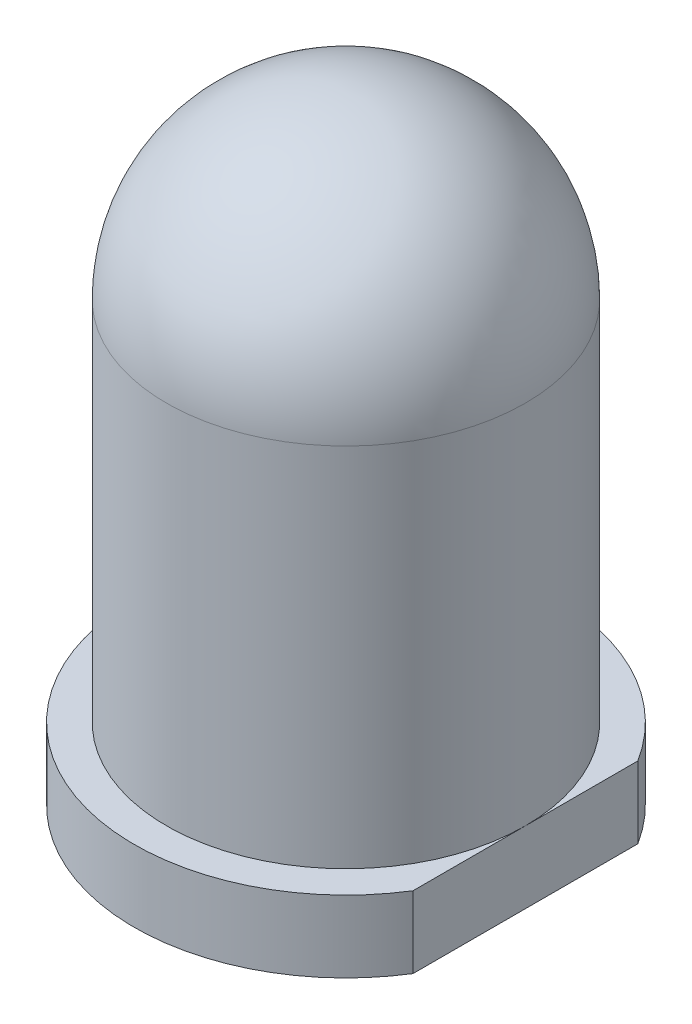
ISO-10303-21;
HEADER;
FILE_DESCRIPTION(('STEP AP214'),'2;1');
FILE_NAME('part.step','',(''),(''),'','','');
FILE_SCHEMA(('AUTOMOTIVE_DESIGN { 1 0 10303 214 1 1 1 1 }'));
ENDSEC;
DATA;
#1=APPLICATION_CONTEXT('core data for automotive mechanical design processes');
#2=APPLICATION_PROTOCOL_DEFINITION('international standard','automotive_design',2000,#1);
#3=PRODUCT_CONTEXT('',#1,'mechanical');
#4=PRODUCT('Part','Part','',(#3));
#5=PRODUCT_RELATED_PRODUCT_CATEGORY('part','',(#4));
#6=PRODUCT_DEFINITION_FORMATION('','',#4);
#7=PRODUCT_DEFINITION_CONTEXT('part definition',#1,'design');
#8=PRODUCT_DEFINITION('design','',#6,#7);
#9=PRODUCT_DEFINITION_SHAPE('','',#8);
#10=(LENGTH_UNIT() NAMED_UNIT(*) SI_UNIT(.MILLI.,.METRE.));
#11=(NAMED_UNIT(*) PLANE_ANGLE_UNIT() SI_UNIT($,.RADIAN.));
#12=(NAMED_UNIT(*) SI_UNIT($,.STERADIAN.) SOLID_ANGLE_UNIT());
#13=UNCERTAINTY_MEASURE_WITH_UNIT(LENGTH_MEASURE(1.E-05),#10,'distance_accuracy_value','');
#14=(GEOMETRIC_REPRESENTATION_CONTEXT(3) GLOBAL_UNCERTAINTY_ASSIGNED_CONTEXT((#13)) GLOBAL_UNIT_ASSIGNED_CONTEXT((#10,
#11,#12)) REPRESENTATION_CONTEXT('',''));
#15=CARTESIAN_POINT('',(0.,0.,0.));
#16=DIRECTION('',(0.,0.,1.));
#17=DIRECTION('',(1.,0.,0.));
#18=AXIS2_PLACEMENT_3D('',#15,#16,#17);
#19=CARTESIAN_POINT('',(0.,0.,0.));
#20=DIRECTION('',(0.,-1.,0.));
#21=DIRECTION('',(0.,0.,-1.));
#22=AXIS2_PLACEMENT_3D('',#19,#20,#21);
#23=PLANE('',#22);
#24=CARTESIAN_POINT('',(0.,0.,0.));
#25=DIRECTION('',(0.,-1.,0.));
#26=DIRECTION('',(0.,0.,-1.));
#27=AXIS2_PLACEMENT_3D('',#24,#25,#26);
#28=CIRCLE('',#27,2.95);
#29=CARTESIAN_POINT('',(2.5,0.,1.56604597633658));
#30=VERTEX_POINT('',#29);
#31=CARTESIAN_POINT('',(2.5,0.,-1.56604597633658));
#32=VERTEX_POINT('',#31);
#33=EDGE_CURVE('E11',#30,#32,#28,.T.);
#34=ORIENTED_EDGE('',*,*,#33,.T.);
#35=DIRECTION('',(0.,0.,1.));
#36=VECTOR('',#35,1.);
#37=CARTESIAN_POINT('',(2.5,0.,1.56604597633658));
#38=LINE('',#37,#36);
#39=EDGE_CURVE('E63',#32,#30,#38,.T.);
#40=ORIENTED_EDGE('',*,*,#39,.T.);
#41=EDGE_LOOP('',(#34,#40));
#42=FACE_BOUND('',#41,.T.);
#43=ADVANCED_FACE('F36',(#42),#23,.T.);
#44=CARTESIAN_POINT('',(0.,-2.35804941091608,0.));
#45=DIRECTION('',(0.,-1.,0.));
#46=DIRECTION('',(0.,0.,-1.));
#47=AXIS2_PLACEMENT_3D('',#44,#45,#46);
#48=CYLINDRICAL_SURFACE('',#47,2.95);
#49=ORIENTED_EDGE('',*,*,#33,.F.);
#50=DIRECTION('',(0.,-1.,0.));
#51=VECTOR('',#50,1.);
#52=CARTESIAN_POINT('',(2.5,8.6,1.56604597633658));
#53=LINE('',#52,#51);
#54=CARTESIAN_POINT('',(2.5,1.,1.56604597633658));
#55=VERTEX_POINT('',#54);
#56=EDGE_CURVE('E66',#55,#30,#53,.T.);
#57=ORIENTED_EDGE('',*,*,#56,.F.);
#58=CARTESIAN_POINT('',(0.,1.,0.));
#59=DIRECTION('',(0.,-1.,0.));
#60=DIRECTION('',(0.,0.,-1.));
#61=AXIS2_PLACEMENT_3D('',#58,#59,#60);
#62=CIRCLE('',#61,2.95);
#63=CARTESIAN_POINT('',(2.5,1.,-1.56604597633658));
#64=VERTEX_POINT('',#63);
#65=EDGE_CURVE('E43',#55,#64,#62,.T.);
#66=ORIENTED_EDGE('',*,*,#65,.T.);
#67=DIRECTION('',(0.,-1.,0.));
#68=VECTOR('',#67,1.);
#69=CARTESIAN_POINT('',(2.5,8.6,-1.56604597633658));
#70=LINE('',#69,#68);
#71=EDGE_CURVE('E50',#64,#32,#70,.T.);
#72=ORIENTED_EDGE('',*,*,#71,.T.);
#73=EDGE_LOOP('',(#49,#57,#66,#72));
#74=FACE_BOUND('',#73,.T.);
#75=ADVANCED_FACE('F72',(#74),#48,.T.);
#76=CARTESIAN_POINT('',(2.95,1.,0.));
#77=DIRECTION('',(0.,1.,0.));
#78=DIRECTION('',(0.,0.,1.));
#79=AXIS2_PLACEMENT_3D('',#76,#77,#78);
#80=PLANE('',#79);
#81=ORIENTED_EDGE('',*,*,#65,.F.);
#82=DIRECTION('',(0.,0.,-1.));
#83=VECTOR('',#82,1.);
#84=CARTESIAN_POINT('',(2.5,1.,0.));
#85=LINE('',#84,#83);
#86=CARTESIAN_POINT('',(2.5,1.,0.));
#87=VERTEX_POINT('',#86);
#88=EDGE_CURVE('E133',#55,#87,#85,.T.);
#89=ORIENTED_EDGE('',*,*,#88,.T.);
#90=CARTESIAN_POINT('',(0.,1.,0.));
#91=DIRECTION('',(0.,-1.,0.));
#92=DIRECTION('',(0.,0.,-1.));
#93=AXIS2_PLACEMENT_3D('',#90,#91,#92);
#94=CIRCLE('',#93,2.5);
#95=EDGE_CURVE('E132',#87,#87,#94,.T.);
#96=ORIENTED_EDGE('',*,*,#95,.T.);
#97=EDGE_CURVE('E54',#87,#64,#85,.T.);
#98=ORIENTED_EDGE('',*,*,#97,.T.);
#99=EDGE_LOOP('',(#81,#89,#96,#98));
#100=FACE_BOUND('',#99,.T.);
#101=ADVANCED_FACE('F79',(#100),#80,.T.);
#102=CARTESIAN_POINT('',(0.,-2.35804941091608,0.));
#103=DIRECTION('',(0.,-1.,0.));
#104=DIRECTION('',(0.,0.,-1.));
#105=AXIS2_PLACEMENT_3D('',#102,#103,#104);
#106=CYLINDRICAL_SURFACE('',#105,2.5);
#107=CARTESIAN_POINT('',(0.,6.1,0.));
#108=DIRECTION('',(0.,-1.,0.));
#109=DIRECTION('',(0.,0.,-1.));
#110=AXIS2_PLACEMENT_3D('',#107,#108,#109);
#111=CIRCLE('',#110,2.5);
#112=CARTESIAN_POINT('',(0.,6.1,-2.5));
#113=VERTEX_POINT('',#112);
#114=EDGE_CURVE('E131',#113,#113,#111,.T.);
#115=ORIENTED_EDGE('',*,*,#114,.T.);
#116=EDGE_LOOP('',(#115));
#117=FACE_BOUND('',#116,.T.);
#118=ORIENTED_EDGE('',*,*,#95,.F.);
#119=EDGE_LOOP('',(#118));
#120=FACE_BOUND('',#119,.T.);
#121=ADVANCED_FACE('F83',(#117,#120),#106,.T.);
#122=CARTESIAN_POINT('',(0.,6.1,0.));
#123=DIRECTION('',(0.,-1.,0.));
#124=DIRECTION('',(1.,0.,0.));
#125=AXIS2_PLACEMENT_3D('',#122,#123,#124);
#126=SPHERICAL_SURFACE('',#125,2.5);
#127=ORIENTED_EDGE('',*,*,#114,.F.);
#128=EDGE_LOOP('',(#127));
#129=FACE_BOUND('',#128,.T.);
#130=ADVANCED_FACE('F89',(#129),#126,.T.);
#131=CARTESIAN_POINT('',(2.5,8.6,1.56604597633658));
#132=DIRECTION('',(1.,0.,0.));
#133=DIRECTION('',(0.,0.,-1.));
#134=AXIS2_PLACEMENT_3D('',#131,#132,#133);
#135=PLANE('',#134);
#136=ORIENTED_EDGE('',*,*,#56,.T.);
#137=ORIENTED_EDGE('',*,*,#39,.F.);
#138=ORIENTED_EDGE('',*,*,#71,.F.);
#139=ORIENTED_EDGE('',*,*,#97,.F.);
#140=ORIENTED_EDGE('',*,*,#88,.F.);
#141=EDGE_LOOP('',(#136,#137,#138,#139,#140));
#142=FACE_BOUND('',#141,.T.);
#143=ADVANCED_FACE('F64',(#142),#135,.T.);
#144=CLOSED_SHELL('',(#43,#75,#101,#121,#130,#143));
#145=MANIFOLD_SOLID_BREP('B2',#144);
#146=ADVANCED_BREP_SHAPE_REPRESENTATION('',(#18,#145),#14);
#147=SHAPE_DEFINITION_REPRESENTATION(#9,#146);
ENDSEC;
END-ISO-10303-21;
